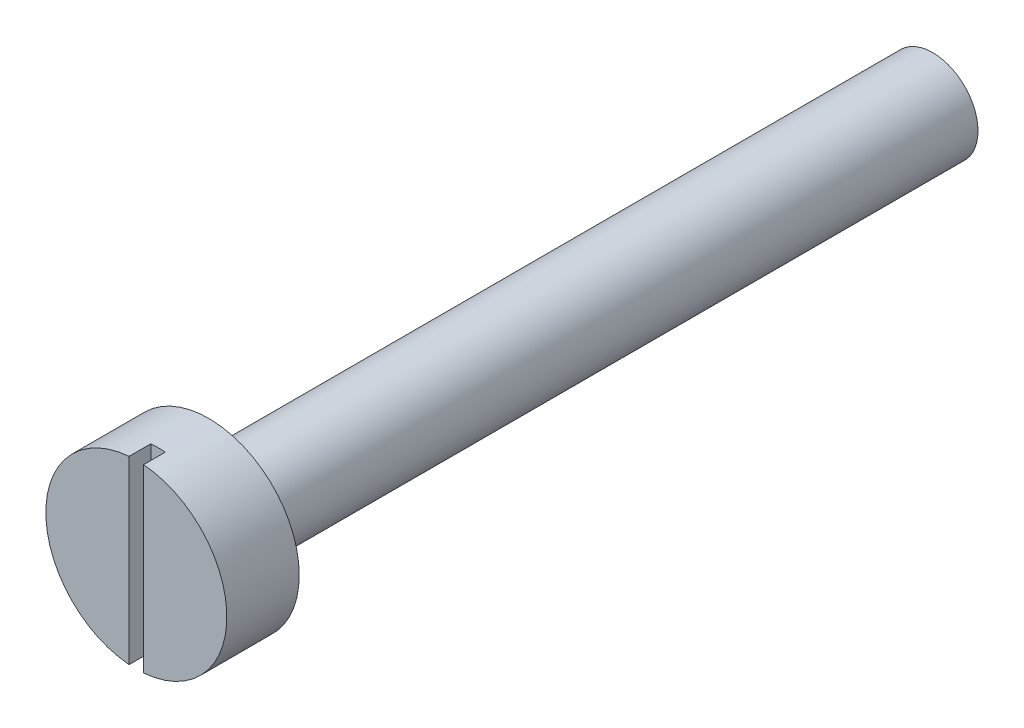
ISO-10303-21;
HEADER;
FILE_DESCRIPTION(('STEP AP214'),'2;1');
FILE_NAME('part.step','',(''),(''),'','','');
FILE_SCHEMA(('AUTOMOTIVE_DESIGN { 1 0 10303 214 1 1 1 1 }'));
ENDSEC;
DATA;
#1=APPLICATION_CONTEXT('core data for automotive mechanical design processes');
#2=APPLICATION_PROTOCOL_DEFINITION('international standard','automotive_design',2000,#1);
#3=PRODUCT_CONTEXT('',#1,'mechanical');
#4=PRODUCT('Part','Part','',(#3));
#5=PRODUCT_RELATED_PRODUCT_CATEGORY('part','',(#4));
#6=PRODUCT_DEFINITION_FORMATION('','',#4);
#7=PRODUCT_DEFINITION_CONTEXT('part definition',#1,'design');
#8=PRODUCT_DEFINITION('design','',#6,#7);
#9=PRODUCT_DEFINITION_SHAPE('','',#8);
#10=(LENGTH_UNIT() NAMED_UNIT(*) SI_UNIT(.MILLI.,.METRE.));
#11=(NAMED_UNIT(*) PLANE_ANGLE_UNIT() SI_UNIT($,.RADIAN.));
#12=(NAMED_UNIT(*) SI_UNIT($,.STERADIAN.) SOLID_ANGLE_UNIT());
#13=UNCERTAINTY_MEASURE_WITH_UNIT(LENGTH_MEASURE(1.E-05),#10,'distance_accuracy_value','');
#14=(GEOMETRIC_REPRESENTATION_CONTEXT(3) GLOBAL_UNCERTAINTY_ASSIGNED_CONTEXT((#13)) GLOBAL_UNIT_ASSIGNED_CONTEXT((#10,
#11,#12)) REPRESENTATION_CONTEXT('',''));
#15=CARTESIAN_POINT('',(0.,0.,0.));
#16=DIRECTION('',(0.,0.,1.));
#17=DIRECTION('',(1.,0.,0.));
#18=AXIS2_PLACEMENT_3D('',#15,#16,#17);
#19=CARTESIAN_POINT('',(0.,0.,39.));
#20=DIRECTION('',(0.,0.,1.));
#21=DIRECTION('',(1.,0.,0.));
#22=AXIS2_PLACEMENT_3D('',#19,#20,#21);
#23=PLANE('',#22);
#24=DIRECTION('',(0.,-1.,0.));
#25=VECTOR('',#24,1.);
#26=CARTESIAN_POINT('',(-0.4,0.,39.));
#27=LINE('',#26,#25);
#28=CARTESIAN_POINT('',(-0.400000000000002,4.98397431775084,39.));
#29=VERTEX_POINT('',#28);
#30=CARTESIAN_POINT('',(-0.399999999999999,-4.98397431775085,39.));
#31=VERTEX_POINT('',#30);
#32=EDGE_CURVE('E79',#29,#31,#27,.T.);
#33=ORIENTED_EDGE('',*,*,#32,.F.);
#34=CARTESIAN_POINT('',(0.,0.,39.));
#35=DIRECTION('',(0.,0.,1.));
#36=DIRECTION('',(1.,0.,0.));
#37=AXIS2_PLACEMENT_3D('',#34,#35,#36);
#38=CIRCLE('',#37,5.);
#39=EDGE_CURVE('E91',#29,#31,#38,.T.);
#40=ORIENTED_EDGE('',*,*,#39,.T.);
#41=EDGE_LOOP('',(#33,#40));
#42=FACE_BOUND('',#41,.T.);
#43=ADVANCED_FACE('F31',(#42),#23,.T.);
#44=CARTESIAN_POINT('',(0.,0.,35.));
#45=DIRECTION('',(0.,0.,-1.));
#46=DIRECTION('',(-1.,0.,0.));
#47=AXIS2_PLACEMENT_3D('',#44,#45,#46);
#48=CYLINDRICAL_SURFACE('',#47,2.5);
#49=CARTESIAN_POINT('',(0.,0.,35.));
#50=DIRECTION('',(0.,0.,1.));
#51=DIRECTION('',(1.,0.,0.));
#52=AXIS2_PLACEMENT_3D('',#49,#50,#51);
#53=CIRCLE('',#52,2.5);
#54=CARTESIAN_POINT('',(2.5,0.,35.));
#55=VERTEX_POINT('',#54);
#56=EDGE_CURVE('E80',#55,#55,#53,.T.);
#57=ORIENTED_EDGE('',*,*,#56,.F.);
#58=EDGE_LOOP('',(#57));
#59=FACE_BOUND('',#58,.T.);
#60=CARTESIAN_POINT('',(0.,0.,-5.));
#61=DIRECTION('',(0.,0.,1.));
#62=DIRECTION('',(1.,0.,0.));
#63=AXIS2_PLACEMENT_3D('',#60,#61,#62);
#64=CIRCLE('',#63,2.5);
#65=CARTESIAN_POINT('',(2.5,0.,-5.));
#66=VERTEX_POINT('',#65);
#67=EDGE_CURVE('E95',#66,#66,#64,.T.);
#68=ORIENTED_EDGE('',*,*,#67,.T.);
#69=EDGE_LOOP('',(#68));
#70=FACE_BOUND('',#69,.T.);
#71=ADVANCED_FACE('F33',(#59,#70),#48,.T.);
#72=CARTESIAN_POINT('',(0.,0.,-5.));
#73=DIRECTION('',(0.,0.,1.));
#74=DIRECTION('',(1.,0.,0.));
#75=AXIS2_PLACEMENT_3D('',#72,#73,#74);
#76=PLANE('',#75);
#77=ORIENTED_EDGE('',*,*,#67,.F.);
#78=EDGE_LOOP('',(#77));
#79=FACE_BOUND('',#78,.T.);
#80=ADVANCED_FACE('F120',(#79),#76,.F.);
#81=CARTESIAN_POINT('',(0.,0.,35.));
#82=DIRECTION('',(0.,0.,1.));
#83=DIRECTION('',(1.,0.,0.));
#84=AXIS2_PLACEMENT_3D('',#81,#82,#83);
#85=PLANE('',#84);
#86=CARTESIAN_POINT('',(0.,0.,35.));
#87=DIRECTION('',(0.,0.,1.));
#88=DIRECTION('',(1.,0.,0.));
#89=AXIS2_PLACEMENT_3D('',#86,#87,#88);
#90=CIRCLE('',#89,5.);
#91=CARTESIAN_POINT('',(5.,0.,35.));
#92=VERTEX_POINT('',#91);
#93=EDGE_CURVE('E92',#92,#92,#90,.T.);
#94=ORIENTED_EDGE('',*,*,#93,.F.);
#95=EDGE_LOOP('',(#94));
#96=FACE_BOUND('',#95,.T.);
#97=ORIENTED_EDGE('',*,*,#56,.T.);
#98=EDGE_LOOP('',(#97));
#99=FACE_BOUND('',#98,.T.);
#100=ADVANCED_FACE('F130',(#96,#99),#85,.F.);
#101=CARTESIAN_POINT('',(0.,0.,39.));
#102=DIRECTION('',(0.,0.,-1.));
#103=DIRECTION('',(-1.,0.,0.));
#104=AXIS2_PLACEMENT_3D('',#101,#102,#103);
#105=CYLINDRICAL_SURFACE('',#104,5.);
#106=ORIENTED_EDGE('',*,*,#39,.F.);
#107=DIRECTION('',(0.,0.,-1.));
#108=VECTOR('',#107,1.);
#109=CARTESIAN_POINT('',(-0.400000000000002,4.98397431775085,39.));
#110=LINE('',#109,#108);
#111=CARTESIAN_POINT('',(-0.400000000000002,4.98397431775084,37.8));
#112=VERTEX_POINT('',#111);
#113=EDGE_CURVE('E97',#29,#112,#110,.T.);
#114=ORIENTED_EDGE('',*,*,#113,.T.);
#115=CARTESIAN_POINT('',(0.,0.,37.8));
#116=DIRECTION('',(0.,0.,-1.));
#117=DIRECTION('',(-1.,0.,0.));
#118=AXIS2_PLACEMENT_3D('',#115,#116,#117);
#119=CIRCLE('',#118,5.);
#120=CARTESIAN_POINT('',(0.400000000000001,4.98397431775084,37.8));
#121=VERTEX_POINT('',#120);
#122=EDGE_CURVE('E11',#112,#121,#119,.T.);
#123=ORIENTED_EDGE('',*,*,#122,.T.);
#124=DIRECTION('',(0.,0.,-1.));
#125=VECTOR('',#124,1.);
#126=CARTESIAN_POINT('',(0.400000000000001,4.98397431775085,39.));
#127=LINE('',#126,#125);
#128=CARTESIAN_POINT('',(0.400000000000001,4.98397431775084,39.));
#129=VERTEX_POINT('',#128);
#130=EDGE_CURVE('E74',#121,#129,#127,.F.);
#131=ORIENTED_EDGE('',*,*,#130,.T.);
#132=CARTESIAN_POINT('',(0.400000000000001,-4.98397431775085,39.));
#133=VERTEX_POINT('',#132);
#134=EDGE_CURVE('E86',#133,#129,#38,.T.);
#135=ORIENTED_EDGE('',*,*,#134,.F.);
#136=DIRECTION('',(0.,0.,-1.));
#137=VECTOR('',#136,1.);
#138=CARTESIAN_POINT('',(0.400000000000001,-4.98397431775085,39.));
#139=LINE('',#138,#137);
#140=CARTESIAN_POINT('',(0.400000000000001,-4.98397431775084,37.8));
#141=VERTEX_POINT('',#140);
#142=EDGE_CURVE('E46',#133,#141,#139,.T.);
#143=ORIENTED_EDGE('',*,*,#142,.T.);
#144=CARTESIAN_POINT('',(-0.399999999999999,-4.98397431775084,37.8));
#145=VERTEX_POINT('',#144);
#146=EDGE_CURVE('E35',#141,#145,#119,.T.);
#147=ORIENTED_EDGE('',*,*,#146,.T.);
#148=DIRECTION('',(0.,0.,-1.));
#149=VECTOR('',#148,1.);
#150=CARTESIAN_POINT('',(-0.399999999999999,-4.98397431775085,39.));
#151=LINE('',#150,#149);
#152=EDGE_CURVE('E54',#145,#31,#151,.F.);
#153=ORIENTED_EDGE('',*,*,#152,.T.);
#154=EDGE_LOOP('',(#106,#114,#123,#131,#135,#143,#147,#153));
#155=FACE_BOUND('',#154,.T.);
#156=ORIENTED_EDGE('',*,*,#93,.T.);
#157=EDGE_LOOP('',(#156));
#158=FACE_BOUND('',#157,.T.);
#159=ADVANCED_FACE('F84',(#155,#158),#105,.T.);
#160=DIRECTION('',(0.,1.,0.));
#161=VECTOR('',#160,1.);
#162=CARTESIAN_POINT('',(0.400000000000001,0.,39.));
#163=LINE('',#162,#161);
#164=EDGE_CURVE('E71',#133,#129,#163,.T.);
#165=ORIENTED_EDGE('',*,*,#164,.F.);
#166=ORIENTED_EDGE('',*,*,#134,.T.);
#167=EDGE_LOOP('',(#165,#166));
#168=FACE_BOUND('',#167,.T.);
#169=ADVANCED_FACE('F90',(#168),#23,.T.);
#170=CARTESIAN_POINT('',(-0.399999999999999,-5.46612334920244,37.8));
#171=DIRECTION('',(0.,0.,-1.));
#172=DIRECTION('',(-1.,0.,0.));
#173=AXIS2_PLACEMENT_3D('',#170,#171,#172);
#174=PLANE('',#173);
#175=DIRECTION('',(0.,-1.,0.));
#176=VECTOR('',#175,1.);
#177=CARTESIAN_POINT('',(-0.399999999999999,-5.46612334920244,37.8));
#178=LINE('',#177,#176);
#179=EDGE_CURVE('E109',#112,#145,#178,.T.);
#180=ORIENTED_EDGE('',*,*,#179,.T.);
#181=ORIENTED_EDGE('',*,*,#146,.F.);
#182=DIRECTION('',(0.,1.,0.));
#183=VECTOR('',#182,1.);
#184=CARTESIAN_POINT('',(0.400000000000001,-5.46612334920244,37.8));
#185=LINE('',#184,#183);
#186=EDGE_CURVE('E88',#141,#121,#185,.T.);
#187=ORIENTED_EDGE('',*,*,#186,.T.);
#188=ORIENTED_EDGE('',*,*,#122,.F.);
#189=EDGE_LOOP('',(#180,#181,#187,#188));
#190=FACE_BOUND('',#189,.T.);
#191=ADVANCED_FACE('F108',(#190),#174,.F.);
#192=CARTESIAN_POINT('',(-0.399999999999999,-5.46612334920244,37.8));
#193=DIRECTION('',(-1.,0.,0.));
#194=DIRECTION('',(0.,-1.,0.));
#195=AXIS2_PLACEMENT_3D('',#192,#193,#194);
#196=PLANE('',#195);
#197=ORIENTED_EDGE('',*,*,#32,.T.);
#198=ORIENTED_EDGE('',*,*,#152,.F.);
#199=ORIENTED_EDGE('',*,*,#179,.F.);
#200=ORIENTED_EDGE('',*,*,#113,.F.);
#201=EDGE_LOOP('',(#197,#198,#199,#200));
#202=FACE_BOUND('',#201,.T.);
#203=ADVANCED_FACE('F113',(#202),#196,.F.);
#204=CARTESIAN_POINT('',(0.400000000000001,-5.46612334920244,37.8));
#205=DIRECTION('',(1.,0.,0.));
#206=DIRECTION('',(0.,0.,-1.));
#207=AXIS2_PLACEMENT_3D('',#204,#205,#206);
#208=PLANE('',#207);
#209=ORIENTED_EDGE('',*,*,#164,.T.);
#210=ORIENTED_EDGE('',*,*,#130,.F.);
#211=ORIENTED_EDGE('',*,*,#186,.F.);
#212=ORIENTED_EDGE('',*,*,#142,.F.);
#213=EDGE_LOOP('',(#209,#210,#211,#212));
#214=FACE_BOUND('',#213,.T.);
#215=ADVANCED_FACE('F73',(#214),#208,.F.);
#216=CLOSED_SHELL('',(#43,#71,#80,#100,#159,#169,#191,#203,#215));
#217=MANIFOLD_SOLID_BREP('B2',#216);
#218=ADVANCED_BREP_SHAPE_REPRESENTATION('',(#18,#217),#14);
#219=SHAPE_DEFINITION_REPRESENTATION(#9,#218);
ENDSEC;
END-ISO-10303-21;
